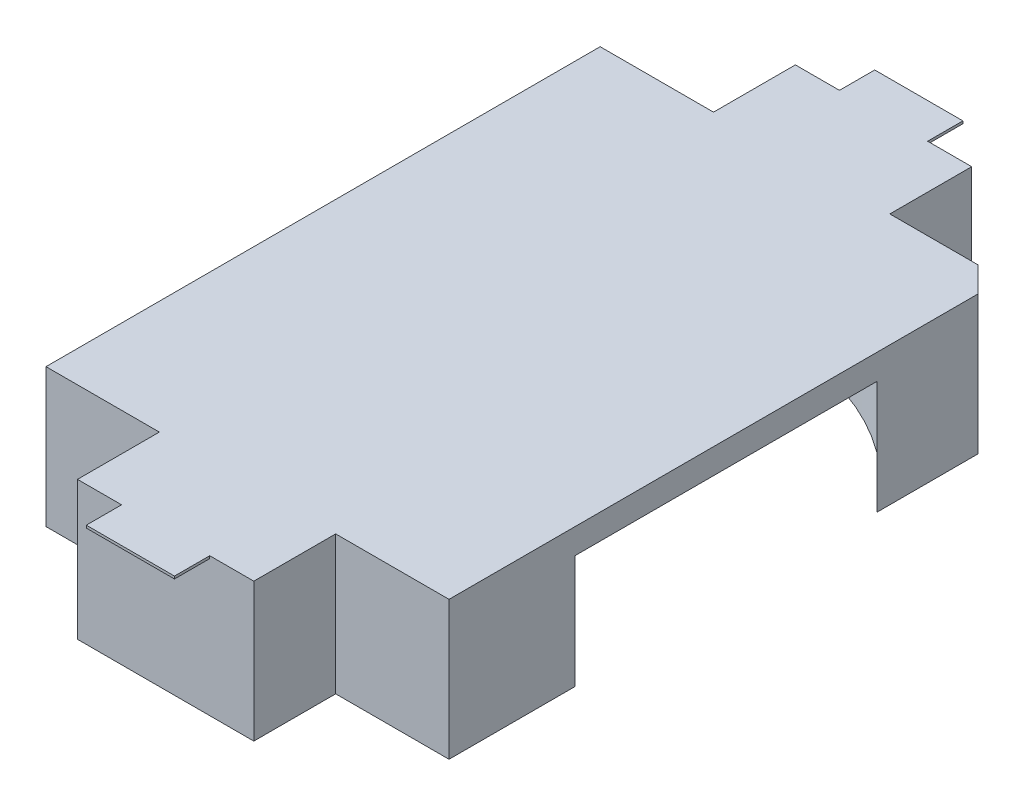
ISO-10303-21;
HEADER;
FILE_DESCRIPTION(('STEP AP214'),'2;1');
FILE_NAME('part.step','',(''),(''),'','','');
FILE_SCHEMA(('AUTOMOTIVE_DESIGN { 1 0 10303 214 1 1 1 1 }'));
ENDSEC;
DATA;
#1=APPLICATION_CONTEXT('core data for automotive mechanical design processes');
#2=APPLICATION_PROTOCOL_DEFINITION('international standard','automotive_design',2000,#1);
#3=PRODUCT_CONTEXT('',#1,'mechanical');
#4=PRODUCT('Part','Part','',(#3));
#5=PRODUCT_RELATED_PRODUCT_CATEGORY('part','',(#4));
#6=PRODUCT_DEFINITION_FORMATION('','',#4);
#7=PRODUCT_DEFINITION_CONTEXT('part definition',#1,'design');
#8=PRODUCT_DEFINITION('design','',#6,#7);
#9=PRODUCT_DEFINITION_SHAPE('','',#8);
#10=(LENGTH_UNIT() NAMED_UNIT(*) SI_UNIT(.MILLI.,.METRE.));
#11=(NAMED_UNIT(*) PLANE_ANGLE_UNIT() SI_UNIT($,.RADIAN.));
#12=(NAMED_UNIT(*) SI_UNIT($,.STERADIAN.) SOLID_ANGLE_UNIT());
#13=UNCERTAINTY_MEASURE_WITH_UNIT(LENGTH_MEASURE(1.E-05),#10,'distance_accuracy_value','');
#14=(GEOMETRIC_REPRESENTATION_CONTEXT(3) GLOBAL_UNCERTAINTY_ASSIGNED_CONTEXT((#13)) GLOBAL_UNIT_ASSIGNED_CONTEXT((#10,
#11,#12)) REPRESENTATION_CONTEXT('',''));
#15=CARTESIAN_POINT('',(0.,0.,0.));
#16=DIRECTION('',(0.,0.,1.));
#17=DIRECTION('',(1.,0.,0.));
#18=AXIS2_PLACEMENT_3D('',#15,#16,#17);
#19=CARTESIAN_POINT('',(-0.872244826069845,-4.4,7.66645635431473));
#20=DIRECTION('',(1.,0.,0.));
#21=DIRECTION('',(0.,0.,-1.));
#22=AXIS2_PLACEMENT_3D('',#19,#20,#21);
#23=PLANE('',#22);
#24=DIRECTION('',(0.,0.,1.));
#25=VECTOR('',#24,1.);
#26=CARTESIAN_POINT('',(-0.872244826069845,-4.5,7.66645635431473));
#27=LINE('',#26,#25);
#28=CARTESIAN_POINT('',(-0.872244826069845,-4.5,7.66645635431473));
#29=VERTEX_POINT('',#28);
#30=CARTESIAN_POINT('',(-0.872244826069844,-4.5,10.5335098182309));
#31=VERTEX_POINT('',#30);
#32=EDGE_CURVE('E127',#29,#31,#27,.T.);
#33=ORIENTED_EDGE('',*,*,#32,.F.);
#34=DIRECTION('',(0.,-1.,0.));
#35=VECTOR('',#34,1.);
#36=CARTESIAN_POINT('',(-0.872244826069845,-4.4,7.66645635431473));
#37=LINE('',#36,#35);
#38=CARTESIAN_POINT('',(-0.872244826069845,-4.4,7.66645635431473));
#39=VERTEX_POINT('',#38);
#40=EDGE_CURVE('E12',#39,#29,#37,.T.);
#41=ORIENTED_EDGE('',*,*,#40,.F.);
#42=DIRECTION('',(0.,0.,1.));
#43=VECTOR('',#42,1.);
#44=CARTESIAN_POINT('',(-0.872244826069845,-4.4,7.66645635431473));
#45=LINE('',#44,#43);
#46=CARTESIAN_POINT('',(-0.872244826069844,-4.4,10.5335098182309));
#47=VERTEX_POINT('',#46);
#48=EDGE_CURVE('E118',#39,#47,#45,.T.);
#49=ORIENTED_EDGE('',*,*,#48,.T.);
#50=DIRECTION('',(0.,-1.,0.));
#51=VECTOR('',#50,1.);
#52=CARTESIAN_POINT('',(-0.872244826069844,-4.4,10.5335098182309));
#53=LINE('',#52,#51);
#54=EDGE_CURVE('E59',#47,#31,#53,.T.);
#55=ORIENTED_EDGE('',*,*,#54,.T.);
#56=EDGE_LOOP('',(#33,#41,#49,#55));
#57=FACE_BOUND('',#56,.T.);
#58=ADVANCED_FACE('F56',(#57),#23,.T.);
#59=CARTESIAN_POINT('',(-1.8664561681021,-4.4,7.66645635431473));
#60=DIRECTION('',(0.,0.,-1.));
#61=DIRECTION('',(-1.,0.,0.));
#62=AXIS2_PLACEMENT_3D('',#59,#60,#61);
#63=PLANE('',#62);
#64=DIRECTION('',(1.,0.,0.));
#65=VECTOR('',#64,1.);
#66=CARTESIAN_POINT('',(-1.8664561681021,-4.5,7.66645635431473));
#67=LINE('',#66,#65);
#68=CARTESIAN_POINT('',(-1.8664561681021,-4.5,7.66645635431473));
#69=VERTEX_POINT('',#68);
#70=EDGE_CURVE('E123',#69,#29,#67,.T.);
#71=ORIENTED_EDGE('',*,*,#70,.F.);
#72=DIRECTION('',(0.,-1.,0.));
#73=VECTOR('',#72,1.);
#74=CARTESIAN_POINT('',(-1.8664561681021,-4.4,7.66645635431473));
#75=LINE('',#74,#73);
#76=CARTESIAN_POINT('',(-1.8664561681021,-4.4,7.66645635431473));
#77=VERTEX_POINT('',#76);
#78=EDGE_CURVE('E66',#77,#69,#75,.T.);
#79=ORIENTED_EDGE('',*,*,#78,.F.);
#80=DIRECTION('',(1.,0.,0.));
#81=VECTOR('',#80,1.);
#82=CARTESIAN_POINT('',(-1.8664561681021,-4.4,7.66645635431473));
#83=LINE('',#82,#81);
#84=EDGE_CURVE('E113',#77,#39,#83,.T.);
#85=ORIENTED_EDGE('',*,*,#84,.T.);
#86=ORIENTED_EDGE('',*,*,#40,.T.);
#87=EDGE_LOOP('',(#71,#79,#85,#86));
#88=FACE_BOUND('',#87,.T.);
#89=ADVANCED_FACE('F142',(#88),#63,.T.);
#90=CARTESIAN_POINT('',(-1.8664561681021,-4.4,10.5335098182309));
#91=DIRECTION('',(-1.,0.,0.));
#92=DIRECTION('',(0.,0.,1.));
#93=AXIS2_PLACEMENT_3D('',#90,#91,#92);
#94=PLANE('',#93);
#95=DIRECTION('',(0.,0.,-1.));
#96=VECTOR('',#95,1.);
#97=CARTESIAN_POINT('',(-1.8664561681021,-4.5,10.5335098182309));
#98=LINE('',#97,#96);
#99=CARTESIAN_POINT('',(-1.8664561681021,-4.5,10.5335098182309));
#100=VERTEX_POINT('',#99);
#101=EDGE_CURVE('E107',#100,#69,#98,.T.);
#102=ORIENTED_EDGE('',*,*,#101,.F.);
#103=DIRECTION('',(0.,-1.,0.));
#104=VECTOR('',#103,1.);
#105=CARTESIAN_POINT('',(-1.8664561681021,-4.4,10.5335098182309));
#106=LINE('',#105,#104);
#107=CARTESIAN_POINT('',(-1.8664561681021,-4.4,10.5335098182309));
#108=VERTEX_POINT('',#107);
#109=EDGE_CURVE('E102',#108,#100,#106,.T.);
#110=ORIENTED_EDGE('',*,*,#109,.F.);
#111=DIRECTION('',(0.,0.,-1.));
#112=VECTOR('',#111,1.);
#113=CARTESIAN_POINT('',(-1.8664561681021,-4.4,10.5335098182309));
#114=LINE('',#113,#112);
#115=EDGE_CURVE('E105',#108,#77,#114,.T.);
#116=ORIENTED_EDGE('',*,*,#115,.T.);
#117=ORIENTED_EDGE('',*,*,#78,.T.);
#118=EDGE_LOOP('',(#102,#110,#116,#117));
#119=FACE_BOUND('',#118,.T.);
#120=ADVANCED_FACE('F104',(#119),#94,.T.);
#121=CARTESIAN_POINT('',(-0.872244826069844,-4.4,10.5335098182309));
#122=DIRECTION('',(0.,0.,1.));
#123=DIRECTION('',(1.,0.,0.));
#124=AXIS2_PLACEMENT_3D('',#121,#122,#123);
#125=PLANE('',#124);
#126=DIRECTION('',(-1.,0.,0.));
#127=VECTOR('',#126,1.);
#128=CARTESIAN_POINT('',(-0.872244826069844,-4.5,10.5335098182309));
#129=LINE('',#128,#127);
#130=EDGE_CURVE('E131',#31,#100,#129,.T.);
#131=ORIENTED_EDGE('',*,*,#130,.F.);
#132=ORIENTED_EDGE('',*,*,#54,.F.);
#133=DIRECTION('',(-1.,0.,0.));
#134=VECTOR('',#133,1.);
#135=CARTESIAN_POINT('',(-0.872244826069844,-4.4,10.5335098182309));
#136=LINE('',#135,#134);
#137=EDGE_CURVE('E112',#47,#108,#136,.T.);
#138=ORIENTED_EDGE('',*,*,#137,.T.);
#139=ORIENTED_EDGE('',*,*,#109,.T.);
#140=EDGE_LOOP('',(#131,#132,#138,#139));
#141=FACE_BOUND('',#140,.T.);
#142=ADVANCED_FACE('F116',(#141),#125,.T.);
#143=CARTESIAN_POINT('',(0.,-4.4,0.));
#144=DIRECTION('',(0.,-1.,0.));
#145=DIRECTION('',(0.,0.,-1.));
#146=AXIS2_PLACEMENT_3D('',#143,#144,#145);
#147=PLANE('',#146);
#148=ORIENTED_EDGE('',*,*,#48,.F.);
#149=ORIENTED_EDGE('',*,*,#84,.F.);
#150=ORIENTED_EDGE('',*,*,#115,.F.);
#151=ORIENTED_EDGE('',*,*,#137,.F.);
#152=EDGE_LOOP('',(#148,#149,#150,#151));
#153=FACE_BOUND('',#152,.T.);
#154=ADVANCED_FACE('F111',(#153),#147,.F.);
#155=CARTESIAN_POINT('',(0.,-4.5,0.));
#156=DIRECTION('',(0.,-1.,0.));
#157=DIRECTION('',(0.,0.,-1.));
#158=AXIS2_PLACEMENT_3D('',#155,#156,#157);
#159=PLANE('',#158);
#160=ORIENTED_EDGE('',*,*,#32,.T.);
#161=ORIENTED_EDGE('',*,*,#130,.T.);
#162=ORIENTED_EDGE('',*,*,#101,.T.);
#163=ORIENTED_EDGE('',*,*,#70,.T.);
#164=EDGE_LOOP('',(#160,#161,#162,#163));
#165=FACE_BOUND('',#164,.T.);
#166=ADVANCED_FACE('F141',(#165),#159,.T.);
#167=CLOSED_SHELL('',(#58,#89,#120,#142,#154,#166));
#168=MANIFOLD_SOLID_BREP('B2',#167);
#169=CARTESIAN_POINT('',(0.872244826069846,-4.4,10.5335098182309));
#170=DIRECTION('',(0.,0.,1.));
#171=DIRECTION('',(1.,0.,0.));
#172=AXIS2_PLACEMENT_3D('',#169,#170,#171);
#173=PLANE('',#172);
#174=DIRECTION('',(-1.,0.,0.));
#175=VECTOR('',#174,1.);
#176=CARTESIAN_POINT('',(0.872244826069846,-4.5,10.5335098182309));
#177=LINE('',#176,#175);
#178=CARTESIAN_POINT('',(1.8664561681021,-4.5,10.5335098182309));
#179=VERTEX_POINT('',#178);
#180=CARTESIAN_POINT('',(0.872244826069846,-4.5,10.5335098182309));
#181=VERTEX_POINT('',#180);
#182=EDGE_CURVE('E280',#179,#181,#177,.T.);
#183=ORIENTED_EDGE('',*,*,#182,.F.);
#184=DIRECTION('',(0.,-1.,0.));
#185=VECTOR('',#184,1.);
#186=CARTESIAN_POINT('',(1.8664561681021,-4.4,10.5335098182309));
#187=LINE('',#186,#185);
#188=CARTESIAN_POINT('',(1.8664561681021,-4.4,10.5335098182309));
#189=VERTEX_POINT('',#188);
#190=EDGE_CURVE('E54',#189,#179,#187,.T.);
#191=ORIENTED_EDGE('',*,*,#190,.F.);
#192=DIRECTION('',(-1.,0.,0.));
#193=VECTOR('',#192,1.);
#194=CARTESIAN_POINT('',(0.872244826069846,-4.4,10.5335098182309));
#195=LINE('',#194,#193);
#196=CARTESIAN_POINT('',(0.872244826069846,-4.4,10.5335098182309));
#197=VERTEX_POINT('',#196);
#198=EDGE_CURVE('E271',#189,#197,#195,.T.);
#199=ORIENTED_EDGE('',*,*,#198,.T.);
#200=DIRECTION('',(0.,-1.,0.));
#201=VECTOR('',#200,1.);
#202=CARTESIAN_POINT('',(0.872244826069846,-4.4,10.5335098182309));
#203=LINE('',#202,#201);
#204=EDGE_CURVE('E212',#197,#181,#203,.T.);
#205=ORIENTED_EDGE('',*,*,#204,.T.);
#206=EDGE_LOOP('',(#183,#191,#199,#205));
#207=FACE_BOUND('',#206,.T.);
#208=ADVANCED_FACE('F209',(#207),#173,.T.);
#209=CARTESIAN_POINT('',(1.8664561681021,-4.4,10.5335098182309));
#210=DIRECTION('',(1.,0.,0.));
#211=DIRECTION('',(0.,0.,-1.));
#212=AXIS2_PLACEMENT_3D('',#209,#210,#211);
#213=PLANE('',#212);
#214=DIRECTION('',(0.,0.,1.));
#215=VECTOR('',#214,1.);
#216=CARTESIAN_POINT('',(1.8664561681021,-4.5,10.5335098182309));
#217=LINE('',#216,#215);
#218=CARTESIAN_POINT('',(1.8664561681021,-4.5,7.66645635431473));
#219=VERTEX_POINT('',#218);
#220=EDGE_CURVE('E275',#219,#179,#217,.T.);
#221=ORIENTED_EDGE('',*,*,#220,.F.);
#222=DIRECTION('',(0.,-1.,0.));
#223=VECTOR('',#222,1.);
#224=CARTESIAN_POINT('',(1.8664561681021,-4.4,7.66645635431473));
#225=LINE('',#224,#223);
#226=CARTESIAN_POINT('',(1.8664561681021,-4.4,7.66645635431473));
#227=VERTEX_POINT('',#226);
#228=EDGE_CURVE('E219',#227,#219,#225,.T.);
#229=ORIENTED_EDGE('',*,*,#228,.F.);
#230=DIRECTION('',(0.,0.,1.));
#231=VECTOR('',#230,1.);
#232=CARTESIAN_POINT('',(1.8664561681021,-4.4,10.5335098182309));
#233=LINE('',#232,#231);
#234=EDGE_CURVE('E266',#227,#189,#233,.T.);
#235=ORIENTED_EDGE('',*,*,#234,.T.);
#236=ORIENTED_EDGE('',*,*,#190,.T.);
#237=EDGE_LOOP('',(#221,#229,#235,#236));
#238=FACE_BOUND('',#237,.T.);
#239=ADVANCED_FACE('F295',(#238),#213,.T.);
#240=CARTESIAN_POINT('',(1.8664561681021,-4.4,7.66645635431473));
#241=DIRECTION('',(0.,0.,-1.));
#242=DIRECTION('',(-1.,0.,0.));
#243=AXIS2_PLACEMENT_3D('',#240,#241,#242);
#244=PLANE('',#243);
#245=DIRECTION('',(1.,0.,0.));
#246=VECTOR('',#245,1.);
#247=CARTESIAN_POINT('',(1.8664561681021,-4.5,7.66645635431473));
#248=LINE('',#247,#246);
#249=CARTESIAN_POINT('',(0.872244826069846,-4.5,7.66645635431473));
#250=VERTEX_POINT('',#249);
#251=EDGE_CURVE('E260',#250,#219,#248,.T.);
#252=ORIENTED_EDGE('',*,*,#251,.F.);
#253=DIRECTION('',(0.,-1.,0.));
#254=VECTOR('',#253,1.);
#255=CARTESIAN_POINT('',(0.872244826069846,-4.4,7.66645635431473));
#256=LINE('',#255,#254);
#257=CARTESIAN_POINT('',(0.872244826069846,-4.4,7.66645635431473));
#258=VERTEX_POINT('',#257);
#259=EDGE_CURVE('E255',#258,#250,#256,.T.);
#260=ORIENTED_EDGE('',*,*,#259,.F.);
#261=DIRECTION('',(1.,0.,0.));
#262=VECTOR('',#261,1.);
#263=CARTESIAN_POINT('',(1.8664561681021,-4.4,7.66645635431473));
#264=LINE('',#263,#262);
#265=EDGE_CURVE('E258',#258,#227,#264,.T.);
#266=ORIENTED_EDGE('',*,*,#265,.T.);
#267=ORIENTED_EDGE('',*,*,#228,.T.);
#268=EDGE_LOOP('',(#252,#260,#266,#267));
#269=FACE_BOUND('',#268,.T.);
#270=ADVANCED_FACE('F257',(#269),#244,.T.);
#271=CARTESIAN_POINT('',(0.872244826069846,-4.4,7.66645635431473));
#272=DIRECTION('',(-1.,0.,0.));
#273=DIRECTION('',(0.,0.,1.));
#274=AXIS2_PLACEMENT_3D('',#271,#272,#273);
#275=PLANE('',#274);
#276=DIRECTION('',(0.,0.,-1.));
#277=VECTOR('',#276,1.);
#278=CARTESIAN_POINT('',(0.872244826069846,-4.5,7.66645635431473));
#279=LINE('',#278,#277);
#280=EDGE_CURVE('E284',#181,#250,#279,.T.);
#281=ORIENTED_EDGE('',*,*,#280,.F.);
#282=ORIENTED_EDGE('',*,*,#204,.F.);
#283=DIRECTION('',(0.,0.,-1.));
#284=VECTOR('',#283,1.);
#285=CARTESIAN_POINT('',(0.872244826069846,-4.4,7.66645635431473));
#286=LINE('',#285,#284);
#287=EDGE_CURVE('E265',#197,#258,#286,.T.);
#288=ORIENTED_EDGE('',*,*,#287,.T.);
#289=ORIENTED_EDGE('',*,*,#259,.T.);
#290=EDGE_LOOP('',(#281,#282,#288,#289));
#291=FACE_BOUND('',#290,.T.);
#292=ADVANCED_FACE('F269',(#291),#275,.T.);
#293=CARTESIAN_POINT('',(0.,-4.4,0.));
#294=DIRECTION('',(0.,1.,0.));
#295=DIRECTION('',(0.,0.,1.));
#296=AXIS2_PLACEMENT_3D('',#293,#294,#295);
#297=PLANE('',#296);
#298=ORIENTED_EDGE('',*,*,#198,.F.);
#299=ORIENTED_EDGE('',*,*,#234,.F.);
#300=ORIENTED_EDGE('',*,*,#265,.F.);
#301=ORIENTED_EDGE('',*,*,#287,.F.);
#302=EDGE_LOOP('',(#298,#299,#300,#301));
#303=FACE_BOUND('',#302,.T.);
#304=ADVANCED_FACE('F264',(#303),#297,.T.);
#305=CARTESIAN_POINT('',(0.,-4.5,0.));
#306=DIRECTION('',(0.,1.,0.));
#307=DIRECTION('',(0.,0.,1.));
#308=AXIS2_PLACEMENT_3D('',#305,#306,#307);
#309=PLANE('',#308);
#310=ORIENTED_EDGE('',*,*,#182,.T.);
#311=ORIENTED_EDGE('',*,*,#280,.T.);
#312=ORIENTED_EDGE('',*,*,#251,.T.);
#313=ORIENTED_EDGE('',*,*,#220,.T.);
#314=EDGE_LOOP('',(#310,#311,#312,#313));
#315=FACE_BOUND('',#314,.T.);
#316=ADVANCED_FACE('F294',(#315),#309,.F.);
#317=CLOSED_SHELL('',(#208,#239,#270,#292,#304,#316));
#318=MANIFOLD_SOLID_BREP('B6',#317);
#319=CARTESIAN_POINT('',(-8.00000000000001,1.,-11.));
#320=DIRECTION('',(0.,0.,1.));
#321=DIRECTION('',(1.,0.,0.));
#322=AXIS2_PLACEMENT_3D('',#319,#320,#321);
#323=PLANE('',#322);
#324=DIRECTION('',(0.,1.,0.));
#325=VECTOR('',#324,1.);
#326=CARTESIAN_POINT('',(-3.5,-12.2176745202166,-11.));
#327=LINE('',#326,#325);
#328=CARTESIAN_POINT('',(-3.5,-4.5,-11.));
#329=VERTEX_POINT('',#328);
#330=CARTESIAN_POINT('',(-3.5,1.,-11.));
#331=VERTEX_POINT('',#330);
#332=EDGE_CURVE('E616',#329,#331,#327,.T.);
#333=ORIENTED_EDGE('',*,*,#332,.F.);
#334=DIRECTION('',(1.,0.,0.));
#335=VECTOR('',#334,1.);
#336=CARTESIAN_POINT('',(7.,-4.5,-11.));
#337=LINE('',#336,#335);
#338=CARTESIAN_POINT('',(-8.00000000000001,-4.5,-11.));
#339=VERTEX_POINT('',#338);
#340=EDGE_CURVE('E692',#339,#329,#337,.T.);
#341=ORIENTED_EDGE('',*,*,#340,.F.);
#342=DIRECTION('',(0.,-1.,0.));
#343=VECTOR('',#342,1.);
#344=CARTESIAN_POINT('',(-8.00000000000001,1.,-11.));
#345=LINE('',#344,#343);
#346=CARTESIAN_POINT('',(-8.00000000000001,1.,-11.));
#347=VERTEX_POINT('',#346);
#348=EDGE_CURVE('E744',#347,#339,#345,.T.);
#349=ORIENTED_EDGE('',*,*,#348,.F.);
#350=DIRECTION('',(-1.,0.,0.));
#351=VECTOR('',#350,1.);
#352=CARTESIAN_POINT('',(-8.00000000000001,1.,-11.));
#353=LINE('',#352,#351);
#354=EDGE_CURVE('E739',#331,#347,#353,.T.);
#355=ORIENTED_EDGE('',*,*,#354,.F.);
#356=EDGE_LOOP('',(#333,#341,#349,#355));
#357=FACE_BOUND('',#356,.T.);
#358=ADVANCED_FACE('F353',(#357),#323,.F.);
#359=CARTESIAN_POINT('',(-8.00000000000001,1.,11.));
#360=DIRECTION('',(0.,0.,-1.));
#361=DIRECTION('',(-1.,0.,0.));
#362=AXIS2_PLACEMENT_3D('',#359,#360,#361);
#363=PLANE('',#362);
#364=DIRECTION('',(0.,1.,0.));
#365=VECTOR('',#364,1.);
#366=CARTESIAN_POINT('',(3.5,-12.2176745202166,11.));
#367=LINE('',#366,#365);
#368=CARTESIAN_POINT('',(3.5,-4.5,11.));
#369=VERTEX_POINT('',#368);
#370=CARTESIAN_POINT('',(3.5,1.,11.));
#371=VERTEX_POINT('',#370);
#372=EDGE_CURVE('E654',#369,#371,#367,.T.);
#373=ORIENTED_EDGE('',*,*,#372,.F.);
#374=DIRECTION('',(-1.,0.,0.));
#375=VECTOR('',#374,1.);
#376=CARTESIAN_POINT('',(-8.00000000000001,-4.5,11.));
#377=LINE('',#376,#375);
#378=CARTESIAN_POINT('',(7.99999999999999,-4.5,11.));
#379=VERTEX_POINT('',#378);
#380=EDGE_CURVE('E678',#379,#369,#377,.T.);
#381=ORIENTED_EDGE('',*,*,#380,.F.);
#382=DIRECTION('',(0.,-1.,0.));
#383=VECTOR('',#382,1.);
#384=CARTESIAN_POINT('',(7.99999999999999,1.,11.));
#385=LINE('',#384,#383);
#386=CARTESIAN_POINT('',(7.99999999999999,1.,11.));
#387=VERTEX_POINT('',#386);
#388=EDGE_CURVE('E759',#387,#379,#385,.T.);
#389=ORIENTED_EDGE('',*,*,#388,.F.);
#390=DIRECTION('',(1.,0.,0.));
#391=VECTOR('',#390,1.);
#392=CARTESIAN_POINT('',(-8.00000000000001,1.,11.));
#393=LINE('',#392,#391);
#394=EDGE_CURVE('E727',#371,#387,#393,.T.);
#395=ORIENTED_EDGE('',*,*,#394,.F.);
#396=EDGE_LOOP('',(#373,#381,#389,#395));
#397=FACE_BOUND('',#396,.T.);
#398=ADVANCED_FACE('F875',(#397),#363,.F.);
#399=CARTESIAN_POINT('',(0.,0.,0.));
#400=DIRECTION('',(0.,-1.,0.));
#401=DIRECTION('',(0.,0.,-1.));
#402=AXIS2_PLACEMENT_3D('',#399,#400,#401);
#403=PLANE('',#402);
#404=DIRECTION('',(0.,0.,-1.));
#405=VECTOR('',#404,1.);
#406=CARTESIAN_POINT('',(7.99999999999999,0.,11.));
#407=LINE('',#406,#405);
#408=CARTESIAN_POINT('',(7.99999999999999,0.,5.99999999999999));
#409=VERTEX_POINT('',#408);
#410=CARTESIAN_POINT('',(7.99999999999999,0.,-6.00000000000001));
#411=VERTEX_POINT('',#410);
#412=EDGE_CURVE('E728',#409,#411,#407,.T.);
#413=ORIENTED_EDGE('',*,*,#412,.F.);
#414=CARTESIAN_POINT('',(0.,0.,0.));
#415=DIRECTION('',(0.,1.,0.));
#416=DIRECTION('',(0.,0.,-1.));
#417=AXIS2_PLACEMENT_3D('',#414,#415,#416);
#418=CIRCLE('',#417,10.);
#419=CARTESIAN_POINT('',(-8.00000000000001,0.,5.99999999999999));
#420=VERTEX_POINT('',#419);
#421=EDGE_CURVE('E665',#420,#409,#418,.T.);
#422=ORIENTED_EDGE('',*,*,#421,.F.);
#423=DIRECTION('',(0.,0.,1.));
#424=VECTOR('',#423,1.);
#425=CARTESIAN_POINT('',(-8.00000000000001,0.,11.));
#426=LINE('',#425,#424);
#427=CARTESIAN_POINT('',(-8.00000000000001,0.,-5.99999999999999));
#428=VERTEX_POINT('',#427);
#429=EDGE_CURVE('E722',#428,#420,#426,.T.);
#430=ORIENTED_EDGE('',*,*,#429,.F.);
#431=CARTESIAN_POINT('',(0.,0.,0.));
#432=DIRECTION('',(0.,1.,0.));
#433=DIRECTION('',(0.,0.,-1.));
#434=AXIS2_PLACEMENT_3D('',#431,#432,#433);
#435=CIRCLE('',#434,10.);
#436=EDGE_CURVE('E691',#411,#428,#435,.T.);
#437=ORIENTED_EDGE('',*,*,#436,.F.);
#438=EDGE_LOOP('',(#413,#422,#430,#437));
#439=FACE_BOUND('',#438,.T.);
#440=ADVANCED_FACE('F949',(#439),#403,.T.);
#441=CARTESIAN_POINT('',(-8.00000000000001,1.,11.));
#442=DIRECTION('',(1.,0.,0.));
#443=DIRECTION('',(0.,0.,-1.));
#444=AXIS2_PLACEMENT_3D('',#441,#442,#443);
#445=PLANE('',#444);
#446=ORIENTED_EDGE('',*,*,#348,.T.);
#447=DIRECTION('',(0.,0.,-1.));
#448=VECTOR('',#447,1.);
#449=CARTESIAN_POINT('',(-8.00000000000001,-4.5,-11.));
#450=LINE('',#449,#448);
#451=CARTESIAN_POINT('',(-8.00000000000001,-4.5,-5.99999999999999));
#452=VERTEX_POINT('',#451);
#453=EDGE_CURVE('E707',#452,#339,#450,.T.);
#454=ORIENTED_EDGE('',*,*,#453,.F.);
#455=DIRECTION('',(0.,1.,0.));
#456=VECTOR('',#455,1.);
#457=CARTESIAN_POINT('',(-8.00000000000001,-4.5,-5.99999999999999));
#458=LINE('',#457,#456);
#459=EDGE_CURVE('E711',#452,#428,#458,.T.);
#460=ORIENTED_EDGE('',*,*,#459,.T.);
#461=ORIENTED_EDGE('',*,*,#429,.T.);
#462=DIRECTION('',(0.,1.,0.));
#463=VECTOR('',#462,1.);
#464=CARTESIAN_POINT('',(-8.00000000000001,-4.5,5.99999999999999));
#465=LINE('',#464,#463);
#466=CARTESIAN_POINT('',(-8.00000000000001,-4.5,5.99999999999999));
#467=VERTEX_POINT('',#466);
#468=EDGE_CURVE('E688',#467,#420,#465,.T.);
#469=ORIENTED_EDGE('',*,*,#468,.F.);
#470=DIRECTION('',(0.,0.,-1.));
#471=VECTOR('',#470,1.);
#472=CARTESIAN_POINT('',(-8.00000000000001,-4.5,5.99999999999999));
#473=LINE('',#472,#471);
#474=CARTESIAN_POINT('',(-8.00000000000001,-4.5,11.));
#475=VERTEX_POINT('',#474);
#476=EDGE_CURVE('E666',#475,#467,#473,.T.);
#477=ORIENTED_EDGE('',*,*,#476,.F.);
#478=DIRECTION('',(0.,-1.,0.));
#479=VECTOR('',#478,1.);
#480=CARTESIAN_POINT('',(-8.00000000000001,1.,11.));
#481=LINE('',#480,#479);
#482=CARTESIAN_POINT('',(-8.00000000000001,1.,11.));
#483=VERTEX_POINT('',#482);
#484=EDGE_CURVE('E762',#483,#475,#481,.T.);
#485=ORIENTED_EDGE('',*,*,#484,.F.);
#486=DIRECTION('',(0.,0.,1.));
#487=VECTOR('',#486,1.);
#488=CARTESIAN_POINT('',(-8.00000000000001,1.,11.));
#489=LINE('',#488,#487);
#490=EDGE_CURVE('E723',#347,#483,#489,.T.);
#491=ORIENTED_EDGE('',*,*,#490,.F.);
#492=EDGE_LOOP('',(#446,#454,#460,#461,#469,#477,#485,#491));
#493=FACE_BOUND('',#492,.T.);
#494=ADVANCED_FACE('F355',(#493),#445,.F.);
#495=CARTESIAN_POINT('',(-3.5,-4.5,11.));
#496=VERTEX_POINT('',#495);
#497=EDGE_CURVE('E677',#496,#475,#377,.T.);
#498=ORIENTED_EDGE('',*,*,#497,.F.);
#499=DIRECTION('',(0.,1.,0.));
#500=VECTOR('',#499,1.);
#501=CARTESIAN_POINT('',(-3.5,-12.2176745202166,11.));
#502=LINE('',#501,#500);
#503=CARTESIAN_POINT('',(-3.5,1.,11.));
#504=VERTEX_POINT('',#503);
#505=EDGE_CURVE('E650',#496,#504,#502,.T.);
#506=ORIENTED_EDGE('',*,*,#505,.T.);
#507=EDGE_CURVE('E729',#483,#504,#393,.T.);
#508=ORIENTED_EDGE('',*,*,#507,.F.);
#509=ORIENTED_EDGE('',*,*,#484,.T.);
#510=EDGE_LOOP('',(#498,#506,#508,#509));
#511=FACE_BOUND('',#510,.T.);
#512=ADVANCED_FACE('F917',(#511),#363,.F.);
#513=CARTESIAN_POINT('',(7.99999999999999,1.,11.));
#514=DIRECTION('',(-1.,0.,0.));
#515=DIRECTION('',(0.,0.,1.));
#516=AXIS2_PLACEMENT_3D('',#513,#514,#515);
#517=PLANE('',#516);
#518=ORIENTED_EDGE('',*,*,#388,.T.);
#519=DIRECTION('',(0.,0.,1.));
#520=VECTOR('',#519,1.);
#521=CARTESIAN_POINT('',(7.99999999999999,-4.5,11.));
#522=LINE('',#521,#520);
#523=CARTESIAN_POINT('',(7.99999999999999,-4.5,6.00000000000001));
#524=VERTEX_POINT('',#523);
#525=EDGE_CURVE('E673',#524,#379,#522,.T.);
#526=ORIENTED_EDGE('',*,*,#525,.F.);
#527=DIRECTION('',(0.,1.,0.));
#528=VECTOR('',#527,1.);
#529=CARTESIAN_POINT('',(7.99999999999999,-4.5,6.00000000000001));
#530=LINE('',#529,#528);
#531=EDGE_CURVE('E682',#524,#409,#530,.T.);
#532=ORIENTED_EDGE('',*,*,#531,.T.);
#533=ORIENTED_EDGE('',*,*,#412,.T.);
#534=DIRECTION('',(0.,1.,0.));
#535=VECTOR('',#534,1.);
#536=CARTESIAN_POINT('',(7.99999999999999,-4.5,-6.00000000000001));
#537=LINE('',#536,#535);
#538=CARTESIAN_POINT('',(7.99999999999999,-4.5,-6.00000000000001));
#539=VERTEX_POINT('',#538);
#540=EDGE_CURVE('E718',#539,#411,#537,.T.);
#541=ORIENTED_EDGE('',*,*,#540,.F.);
#542=DIRECTION('',(0.,0.,1.));
#543=VECTOR('',#542,1.);
#544=CARTESIAN_POINT('',(7.99999999999999,-4.5,-6.00000000000001));
#545=LINE('',#544,#543);
#546=CARTESIAN_POINT('',(7.99999999999999,-4.5,-10.));
#547=VERTEX_POINT('',#546);
#548=EDGE_CURVE('E701',#547,#539,#545,.T.);
#549=ORIENTED_EDGE('',*,*,#548,.F.);
#550=DIRECTION('',(0.,-1.,0.));
#551=VECTOR('',#550,1.);
#552=CARTESIAN_POINT('',(7.99999999999999,1.,-10.));
#553=LINE('',#552,#551);
#554=CARTESIAN_POINT('',(7.99999999999999,1.,-10.));
#555=VERTEX_POINT('',#554);
#556=EDGE_CURVE('E756',#555,#547,#553,.T.);
#557=ORIENTED_EDGE('',*,*,#556,.F.);
#558=DIRECTION('',(0.,0.,-1.));
#559=VECTOR('',#558,1.);
#560=CARTESIAN_POINT('',(7.99999999999999,1.,11.));
#561=LINE('',#560,#559);
#562=EDGE_CURVE('E733',#387,#555,#561,.T.);
#563=ORIENTED_EDGE('',*,*,#562,.F.);
#564=EDGE_LOOP('',(#518,#526,#532,#533,#541,#549,#557,#563));
#565=FACE_BOUND('',#564,.T.);
#566=ADVANCED_FACE('F882',(#565),#517,.F.);
#567=CARTESIAN_POINT('',(7.,1.,-11.));
#568=DIRECTION('',(-0.707106781186548,0.,0.707106781186548));
#569=DIRECTION('',(0.707106781186548,0.,0.707106781186548));
#570=AXIS2_PLACEMENT_3D('',#567,#568,#569);
#571=PLANE('',#570);
#572=ORIENTED_EDGE('',*,*,#556,.T.);
#573=DIRECTION('',(0.707106781186548,0.,0.707106781186548));
#574=VECTOR('',#573,1.);
#575=CARTESIAN_POINT('',(7.99999999999999,-4.5,-10.));
#576=LINE('',#575,#574);
#577=CARTESIAN_POINT('',(7.,-4.5,-11.));
#578=VERTEX_POINT('',#577);
#579=EDGE_CURVE('E696',#578,#547,#576,.T.);
#580=ORIENTED_EDGE('',*,*,#579,.F.);
#581=DIRECTION('',(0.,-1.,0.));
#582=VECTOR('',#581,1.);
#583=CARTESIAN_POINT('',(7.,1.,-11.));
#584=LINE('',#583,#582);
#585=CARTESIAN_POINT('',(7.,1.,-11.));
#586=VERTEX_POINT('',#585);
#587=EDGE_CURVE('E752',#586,#578,#584,.T.);
#588=ORIENTED_EDGE('',*,*,#587,.F.);
#589=DIRECTION('',(-0.707106781186548,0.,-0.707106781186548));
#590=VECTOR('',#589,1.);
#591=CARTESIAN_POINT('',(7.,1.,-11.));
#592=LINE('',#591,#590);
#593=EDGE_CURVE('E736',#555,#586,#592,.T.);
#594=ORIENTED_EDGE('',*,*,#593,.F.);
#595=EDGE_LOOP('',(#572,#580,#588,#594));
#596=FACE_BOUND('',#595,.T.);
#597=ADVANCED_FACE('F891',(#596),#571,.F.);
#598=CARTESIAN_POINT('',(3.5,-4.5,-11.));
#599=VERTEX_POINT('',#598);
#600=EDGE_CURVE('E697',#599,#578,#337,.T.);
#601=ORIENTED_EDGE('',*,*,#600,.F.);
#602=DIRECTION('',(0.,1.,0.));
#603=VECTOR('',#602,1.);
#604=CARTESIAN_POINT('',(3.5,-12.2176745202166,-11.));
#605=LINE('',#604,#603);
#606=CARTESIAN_POINT('',(3.5,1.,-11.));
#607=VERTEX_POINT('',#606);
#608=EDGE_CURVE('E613',#599,#607,#605,.T.);
#609=ORIENTED_EDGE('',*,*,#608,.T.);
#610=EDGE_CURVE('E740',#586,#607,#353,.T.);
#611=ORIENTED_EDGE('',*,*,#610,.F.);
#612=ORIENTED_EDGE('',*,*,#587,.T.);
#613=EDGE_LOOP('',(#601,#609,#611,#612));
#614=FACE_BOUND('',#613,.T.);
#615=ADVANCED_FACE('F894',(#614),#323,.F.);
#616=CARTESIAN_POINT('',(0.,1.,0.));
#617=DIRECTION('',(0.,-1.,0.));
#618=DIRECTION('',(0.,0.,-1.));
#619=AXIS2_PLACEMENT_3D('',#616,#617,#618);
#620=PLANE('',#619);
#621=DIRECTION('',(-1.,0.,0.));
#622=VECTOR('',#621,1.);
#623=CARTESIAN_POINT('',(3.5,1.,-14.25));
#624=LINE('',#623,#622);
#625=CARTESIAN_POINT('',(3.5,1.,-14.25));
#626=VERTEX_POINT('',#625);
#627=CARTESIAN_POINT('',(1.75,1.,-14.25));
#628=VERTEX_POINT('',#627);
#629=EDGE_CURVE('E596',#626,#628,#624,.T.);
#630=ORIENTED_EDGE('',*,*,#629,.T.);
#631=DIRECTION('',(0.,0.,-1.));
#632=VECTOR('',#631,1.);
#633=CARTESIAN_POINT('',(1.75,1.,15.65));
#634=LINE('',#633,#632);
#635=CARTESIAN_POINT('',(1.75,1.,-15.65));
#636=VERTEX_POINT('',#635);
#637=EDGE_CURVE('E568',#628,#636,#634,.T.);
#638=ORIENTED_EDGE('',*,*,#637,.T.);
#639=DIRECTION('',(-1.,0.,0.));
#640=VECTOR('',#639,1.);
#641=CARTESIAN_POINT('',(1.75,1.,-15.65));
#642=LINE('',#641,#640);
#643=CARTESIAN_POINT('',(-1.75,1.,-15.65));
#644=VERTEX_POINT('',#643);
#645=EDGE_CURVE('E533',#636,#644,#642,.T.);
#646=ORIENTED_EDGE('',*,*,#645,.T.);
#647=DIRECTION('',(0.,0.,1.));
#648=VECTOR('',#647,1.);
#649=CARTESIAN_POINT('',(-1.75,1.,15.65));
#650=LINE('',#649,#648);
#651=CARTESIAN_POINT('',(-1.75,1.,-14.25));
#652=VERTEX_POINT('',#651);
#653=EDGE_CURVE('E376',#644,#652,#650,.T.);
#654=ORIENTED_EDGE('',*,*,#653,.T.);
#655=CARTESIAN_POINT('',(-3.5,1.,-14.25));
#656=VERTEX_POINT('',#655);
#657=EDGE_CURVE('E600',#652,#656,#624,.T.);
#658=ORIENTED_EDGE('',*,*,#657,.T.);
#659=DIRECTION('',(0.,0.,1.));
#660=VECTOR('',#659,1.);
#661=CARTESIAN_POINT('',(-3.5,1.,-14.25));
#662=LINE('',#661,#660);
#663=EDGE_CURVE('E591',#656,#331,#662,.T.);
#664=ORIENTED_EDGE('',*,*,#663,.T.);
#665=ORIENTED_EDGE('',*,*,#354,.T.);
#666=ORIENTED_EDGE('',*,*,#490,.T.);
#667=ORIENTED_EDGE('',*,*,#507,.T.);
#668=DIRECTION('',(0.,0.,1.));
#669=VECTOR('',#668,1.);
#670=CARTESIAN_POINT('',(-3.5,1.,11.));
#671=LINE('',#670,#669);
#672=CARTESIAN_POINT('',(-3.5,1.,14.25));
#673=VERTEX_POINT('',#672);
#674=EDGE_CURVE('E627',#504,#673,#671,.T.);
#675=ORIENTED_EDGE('',*,*,#674,.T.);
#676=DIRECTION('',(1.,0.,0.));
#677=VECTOR('',#676,1.);
#678=CARTESIAN_POINT('',(3.5,1.,14.25));
#679=LINE('',#678,#677);
#680=CARTESIAN_POINT('',(-1.75,1.,14.25));
#681=VERTEX_POINT('',#680);
#682=EDGE_CURVE('E633',#673,#681,#679,.T.);
#683=ORIENTED_EDGE('',*,*,#682,.T.);
#684=CARTESIAN_POINT('',(-1.75,1.,15.65));
#685=VERTEX_POINT('',#684);
#686=EDGE_CURVE('E565',#681,#685,#650,.T.);
#687=ORIENTED_EDGE('',*,*,#686,.T.);
#688=DIRECTION('',(1.,0.,0.));
#689=VECTOR('',#688,1.);
#690=CARTESIAN_POINT('',(1.75,1.,15.65));
#691=LINE('',#690,#689);
#692=CARTESIAN_POINT('',(1.75,1.,15.65));
#693=VERTEX_POINT('',#692);
#694=EDGE_CURVE('E539',#685,#693,#691,.T.);
#695=ORIENTED_EDGE('',*,*,#694,.T.);
#696=CARTESIAN_POINT('',(1.75,1.,14.25));
#697=VERTEX_POINT('',#696);
#698=EDGE_CURVE('E369',#693,#697,#634,.T.);
#699=ORIENTED_EDGE('',*,*,#698,.T.);
#700=CARTESIAN_POINT('',(3.5,1.,14.25));
#701=VERTEX_POINT('',#700);
#702=EDGE_CURVE('E637',#697,#701,#679,.T.);
#703=ORIENTED_EDGE('',*,*,#702,.T.);
#704=DIRECTION('',(0.,0.,-1.));
#705=VECTOR('',#704,1.);
#706=CARTESIAN_POINT('',(3.5,1.,11.));
#707=LINE('',#706,#705);
#708=EDGE_CURVE('E628',#701,#371,#707,.T.);
#709=ORIENTED_EDGE('',*,*,#708,.T.);
#710=ORIENTED_EDGE('',*,*,#394,.T.);
#711=ORIENTED_EDGE('',*,*,#562,.T.);
#712=ORIENTED_EDGE('',*,*,#593,.T.);
#713=ORIENTED_EDGE('',*,*,#610,.T.);
#714=DIRECTION('',(0.,0.,-1.));
#715=VECTOR('',#714,1.);
#716=CARTESIAN_POINT('',(3.5,1.,-14.25));
#717=LINE('',#716,#715);
#718=EDGE_CURVE('E590',#607,#626,#717,.T.);
#719=ORIENTED_EDGE('',*,*,#718,.T.);
#720=EDGE_LOOP('',(#630,#638,#646,#654,#658,#664,#665,#666,#667,#675,#683,#687,#695,#699,#703,
#709,#710,#711,#712,#713,#719));
#721=FACE_BOUND('',#720,.T.);
#722=ADVANCED_FACE('F790',(#721),#620,.F.);
#723=CARTESIAN_POINT('',(0.,-4.5,0.));
#724=DIRECTION('',(0.,1.,0.));
#725=DIRECTION('',(0.,0.,1.));
#726=AXIS2_PLACEMENT_3D('',#723,#724,#725);
#727=CYLINDRICAL_SURFACE('',#726,10.);
#728=ORIENTED_EDGE('',*,*,#436,.T.);
#729=ORIENTED_EDGE('',*,*,#459,.F.);
#730=CARTESIAN_POINT('',(0.,-4.5,0.));
#731=DIRECTION('',(0.,1.,0.));
#732=DIRECTION('',(0.,0.,-1.));
#733=AXIS2_PLACEMENT_3D('',#730,#731,#732);
#734=CIRCLE('',#733,10.);
#735=EDGE_CURVE('E704',#539,#452,#734,.T.);
#736=ORIENTED_EDGE('',*,*,#735,.F.);
#737=ORIENTED_EDGE('',*,*,#540,.T.);
#738=EDGE_LOOP('',(#728,#729,#736,#737));
#739=FACE_BOUND('',#738,.T.);
#740=ADVANCED_FACE('F957',(#739),#727,.F.);
#741=CARTESIAN_POINT('',(0.,-4.5,0.));
#742=DIRECTION('',(0.,-1.,0.));
#743=DIRECTION('',(0.,0.,-1.));
#744=AXIS2_PLACEMENT_3D('',#741,#742,#743);
#745=PLANE('',#744);
#746=ORIENTED_EDGE('',*,*,#340,.T.);
#747=DIRECTION('',(0.,0.,1.));
#748=VECTOR('',#747,1.);
#749=CARTESIAN_POINT('',(-3.5,-4.5,-14.25));
#750=LINE('',#749,#748);
#751=CARTESIAN_POINT('',(-3.5,-4.5,-14.25));
#752=VERTEX_POINT('',#751);
#753=EDGE_CURVE('E614',#752,#329,#750,.T.);
#754=ORIENTED_EDGE('',*,*,#753,.F.);
#755=DIRECTION('',(-1.,0.,0.));
#756=VECTOR('',#755,1.);
#757=CARTESIAN_POINT('',(3.5,-4.5,-14.25));
#758=LINE('',#757,#756);
#759=CARTESIAN_POINT('',(3.5,-4.5,-14.25));
#760=VERTEX_POINT('',#759);
#761=EDGE_CURVE('E595',#760,#752,#758,.T.);
#762=ORIENTED_EDGE('',*,*,#761,.F.);
#763=DIRECTION('',(0.,0.,-1.));
#764=VECTOR('',#763,1.);
#765=CARTESIAN_POINT('',(3.5,-4.5,-14.25));
#766=LINE('',#765,#764);
#767=EDGE_CURVE('E608',#599,#760,#766,.T.);
#768=ORIENTED_EDGE('',*,*,#767,.F.);
#769=ORIENTED_EDGE('',*,*,#600,.T.);
#770=ORIENTED_EDGE('',*,*,#579,.T.);
#771=ORIENTED_EDGE('',*,*,#548,.T.);
#772=ORIENTED_EDGE('',*,*,#735,.T.);
#773=ORIENTED_EDGE('',*,*,#453,.T.);
#774=EDGE_LOOP('',(#746,#754,#762,#768,#769,#770,#771,#772,#773));
#775=FACE_BOUND('',#774,.T.);
#776=ADVANCED_FACE('F902',(#775),#745,.T.);
#777=CARTESIAN_POINT('',(0.,-4.5,0.));
#778=DIRECTION('',(0.,1.,0.));
#779=DIRECTION('',(0.,0.,1.));
#780=AXIS2_PLACEMENT_3D('',#777,#778,#779);
#781=CYLINDRICAL_SURFACE('',#780,10.);
#782=ORIENTED_EDGE('',*,*,#421,.T.);
#783=ORIENTED_EDGE('',*,*,#531,.F.);
#784=CARTESIAN_POINT('',(0.,-4.5,0.));
#785=DIRECTION('',(0.,1.,0.));
#786=DIRECTION('',(0.,0.,-1.));
#787=AXIS2_PLACEMENT_3D('',#784,#785,#786);
#788=CIRCLE('',#787,10.);
#789=EDGE_CURVE('E670',#467,#524,#788,.T.);
#790=ORIENTED_EDGE('',*,*,#789,.F.);
#791=ORIENTED_EDGE('',*,*,#468,.T.);
#792=EDGE_LOOP('',(#782,#783,#790,#791));
#793=FACE_BOUND('',#792,.T.);
#794=ADVANCED_FACE('F980',(#793),#781,.F.);
#795=CARTESIAN_POINT('',(0.,-4.5,0.));
#796=DIRECTION('',(0.,-1.,0.));
#797=DIRECTION('',(0.,0.,-1.));
#798=AXIS2_PLACEMENT_3D('',#795,#796,#797);
#799=PLANE('',#798);
#800=ORIENTED_EDGE('',*,*,#476,.T.);
#801=ORIENTED_EDGE('',*,*,#789,.T.);
#802=ORIENTED_EDGE('',*,*,#525,.T.);
#803=ORIENTED_EDGE('',*,*,#380,.T.);
#804=DIRECTION('',(0.,0.,-1.));
#805=VECTOR('',#804,1.);
#806=CARTESIAN_POINT('',(3.5,-4.5,11.));
#807=LINE('',#806,#805);
#808=CARTESIAN_POINT('',(3.5,-4.5,14.25));
#809=VERTEX_POINT('',#808);
#810=EDGE_CURVE('E651',#809,#369,#807,.T.);
#811=ORIENTED_EDGE('',*,*,#810,.F.);
#812=DIRECTION('',(1.,0.,0.));
#813=VECTOR('',#812,1.);
#814=CARTESIAN_POINT('',(3.5,-4.5,14.25));
#815=LINE('',#814,#813);
#816=CARTESIAN_POINT('',(-3.5,-4.5,14.25));
#817=VERTEX_POINT('',#816);
#818=EDGE_CURVE('E632',#817,#809,#815,.T.);
#819=ORIENTED_EDGE('',*,*,#818,.F.);
#820=DIRECTION('',(0.,0.,1.));
#821=VECTOR('',#820,1.);
#822=CARTESIAN_POINT('',(-3.5,-4.5,11.));
#823=LINE('',#822,#821);
#824=EDGE_CURVE('E645',#496,#817,#823,.T.);
#825=ORIENTED_EDGE('',*,*,#824,.F.);
#826=ORIENTED_EDGE('',*,*,#497,.T.);
#827=EDGE_LOOP('',(#800,#801,#802,#803,#811,#819,#825,#826));
#828=FACE_BOUND('',#827,.T.);
#829=ADVANCED_FACE('F878',(#828),#799,.T.);
#830=CARTESIAN_POINT('',(3.5,-12.2176745202166,14.25));
#831=DIRECTION('',(0.,0.,1.));
#832=DIRECTION('',(1.,0.,0.));
#833=AXIS2_PLACEMENT_3D('',#830,#831,#832);
#834=PLANE('',#833);
#835=DIRECTION('',(0.,-1.,0.));
#836=VECTOR('',#835,1.);
#837=CARTESIAN_POINT('',(-1.75,-12.2176745202166,14.25));
#838=LINE('',#837,#836);
#839=CARTESIAN_POINT('',(-1.75,0.9,14.25));
#840=VERTEX_POINT('',#839);
#841=EDGE_CURVE('E527',#681,#840,#838,.T.);
#842=ORIENTED_EDGE('',*,*,#841,.F.);
#843=ORIENTED_EDGE('',*,*,#682,.F.);
#844=DIRECTION('',(0.,1.,0.));
#845=VECTOR('',#844,1.);
#846=CARTESIAN_POINT('',(-3.5,-12.2176745202166,14.25));
#847=LINE('',#846,#845);
#848=EDGE_CURVE('E649',#817,#673,#847,.T.);
#849=ORIENTED_EDGE('',*,*,#848,.F.);
#850=ORIENTED_EDGE('',*,*,#818,.T.);
#851=DIRECTION('',(0.,1.,0.));
#852=VECTOR('',#851,1.);
#853=CARTESIAN_POINT('',(3.5,-12.2176745202166,14.25));
#854=LINE('',#853,#852);
#855=EDGE_CURVE('E644',#809,#701,#854,.T.);
#856=ORIENTED_EDGE('',*,*,#855,.T.);
#857=ORIENTED_EDGE('',*,*,#702,.F.);
#858=DIRECTION('',(0.,1.,0.));
#859=VECTOR('',#858,1.);
#860=CARTESIAN_POINT('',(1.75,-12.2176745202166,14.25));
#861=LINE('',#860,#859);
#862=CARTESIAN_POINT('',(1.75,0.9,14.25));
#863=VERTEX_POINT('',#862);
#864=EDGE_CURVE('E585',#863,#697,#861,.T.);
#865=ORIENTED_EDGE('',*,*,#864,.F.);
#866=DIRECTION('',(-1.,0.,0.));
#867=VECTOR('',#866,1.);
#868=CARTESIAN_POINT('',(3.5,0.9,14.25));
#869=LINE('',#868,#867);
#870=EDGE_CURVE('E576',#863,#840,#869,.T.);
#871=ORIENTED_EDGE('',*,*,#870,.T.);
#872=EDGE_LOOP('',(#842,#843,#849,#850,#856,#857,#865,#871));
#873=FACE_BOUND('',#872,.T.);
#874=ADVANCED_FACE('F868',(#873),#834,.T.);
#875=CARTESIAN_POINT('',(3.5,-12.2176745202166,11.));
#876=DIRECTION('',(1.,0.,0.));
#877=DIRECTION('',(0.,0.,-1.));
#878=AXIS2_PLACEMENT_3D('',#875,#876,#877);
#879=PLANE('',#878);
#880=ORIENTED_EDGE('',*,*,#855,.F.);
#881=ORIENTED_EDGE('',*,*,#810,.T.);
#882=ORIENTED_EDGE('',*,*,#372,.T.);
#883=ORIENTED_EDGE('',*,*,#708,.F.);
#884=EDGE_LOOP('',(#880,#881,#882,#883));
#885=FACE_BOUND('',#884,.T.);
#886=ADVANCED_FACE('F871',(#885),#879,.T.);
#887=CARTESIAN_POINT('',(-3.5,-12.2176745202166,11.));
#888=DIRECTION('',(-1.,0.,0.));
#889=DIRECTION('',(0.,0.,1.));
#890=AXIS2_PLACEMENT_3D('',#887,#888,#889);
#891=PLANE('',#890);
#892=ORIENTED_EDGE('',*,*,#505,.F.);
#893=ORIENTED_EDGE('',*,*,#824,.T.);
#894=ORIENTED_EDGE('',*,*,#848,.T.);
#895=ORIENTED_EDGE('',*,*,#674,.F.);
#896=EDGE_LOOP('',(#892,#893,#894,#895));
#897=FACE_BOUND('',#896,.T.);
#898=ADVANCED_FACE('F920',(#897),#891,.T.);
#899=CARTESIAN_POINT('',(3.5,-12.2176745202166,-14.25));
#900=DIRECTION('',(0.,0.,-1.));
#901=DIRECTION('',(-1.,0.,0.));
#902=AXIS2_PLACEMENT_3D('',#899,#900,#901);
#903=PLANE('',#902);
#904=DIRECTION('',(0.,1.,0.));
#905=VECTOR('',#904,1.);
#906=CARTESIAN_POINT('',(-1.75,-12.2176745202166,-14.25));
#907=LINE('',#906,#905);
#908=CARTESIAN_POINT('',(-1.75,0.9,-14.25));
#909=VERTEX_POINT('',#908);
#910=EDGE_CURVE('E207',#909,#652,#907,.T.);
#911=ORIENTED_EDGE('',*,*,#910,.F.);
#912=DIRECTION('',(1.,0.,0.));
#913=VECTOR('',#912,1.);
#914=CARTESIAN_POINT('',(3.5,0.9,-14.25));
#915=LINE('',#914,#913);
#916=CARTESIAN_POINT('',(1.75,0.9,-14.25));
#917=VERTEX_POINT('',#916);
#918=EDGE_CURVE('E766',#909,#917,#915,.T.);
#919=ORIENTED_EDGE('',*,*,#918,.T.);
#920=DIRECTION('',(0.,-1.,0.));
#921=VECTOR('',#920,1.);
#922=CARTESIAN_POINT('',(1.75,-12.2176745202166,-14.25));
#923=LINE('',#922,#921);
#924=EDGE_CURVE('E362',#628,#917,#923,.T.);
#925=ORIENTED_EDGE('',*,*,#924,.F.);
#926=ORIENTED_EDGE('',*,*,#629,.F.);
#927=DIRECTION('',(0.,1.,0.));
#928=VECTOR('',#927,1.);
#929=CARTESIAN_POINT('',(3.5,-12.2176745202166,-14.25));
#930=LINE('',#929,#928);
#931=EDGE_CURVE('E612',#760,#626,#930,.T.);
#932=ORIENTED_EDGE('',*,*,#931,.F.);
#933=ORIENTED_EDGE('',*,*,#761,.T.);
#934=DIRECTION('',(0.,1.,0.));
#935=VECTOR('',#934,1.);
#936=CARTESIAN_POINT('',(-3.5,-12.2176745202166,-14.25));
#937=LINE('',#936,#935);
#938=EDGE_CURVE('E607',#752,#656,#937,.T.);
#939=ORIENTED_EDGE('',*,*,#938,.T.);
#940=ORIENTED_EDGE('',*,*,#657,.F.);
#941=EDGE_LOOP('',(#911,#919,#925,#926,#932,#933,#939,#940));
#942=FACE_BOUND('',#941,.T.);
#943=ADVANCED_FACE('F783',(#942),#903,.T.);
#944=CARTESIAN_POINT('',(-3.5,-12.2176745202166,-14.25));
#945=DIRECTION('',(-1.,0.,0.));
#946=DIRECTION('',(0.,0.,1.));
#947=AXIS2_PLACEMENT_3D('',#944,#945,#946);
#948=PLANE('',#947);
#949=ORIENTED_EDGE('',*,*,#938,.F.);
#950=ORIENTED_EDGE('',*,*,#753,.T.);
#951=ORIENTED_EDGE('',*,*,#332,.T.);
#952=ORIENTED_EDGE('',*,*,#663,.F.);
#953=EDGE_LOOP('',(#949,#950,#951,#952));
#954=FACE_BOUND('',#953,.T.);
#955=ADVANCED_FACE('F906',(#954),#948,.T.);
#956=CARTESIAN_POINT('',(3.5,-12.2176745202166,-14.25));
#957=DIRECTION('',(1.,0.,0.));
#958=DIRECTION('',(0.,0.,-1.));
#959=AXIS2_PLACEMENT_3D('',#956,#957,#958);
#960=PLANE('',#959);
#961=ORIENTED_EDGE('',*,*,#608,.F.);
#962=ORIENTED_EDGE('',*,*,#767,.T.);
#963=ORIENTED_EDGE('',*,*,#931,.T.);
#964=ORIENTED_EDGE('',*,*,#718,.F.);
#965=EDGE_LOOP('',(#961,#962,#963,#964));
#966=FACE_BOUND('',#965,.T.);
#967=ADVANCED_FACE('F897',(#966),#960,.T.);
#968=CARTESIAN_POINT('',(1.75,0.9,-15.65));
#969=DIRECTION('',(0.,0.,-1.));
#970=DIRECTION('',(-1.,0.,0.));
#971=AXIS2_PLACEMENT_3D('',#968,#969,#970);
#972=PLANE('',#971);
#973=ORIENTED_EDGE('',*,*,#645,.F.);
#974=DIRECTION('',(0.,1.,0.));
#975=VECTOR('',#974,1.);
#976=CARTESIAN_POINT('',(1.75,0.9,-15.65));
#977=LINE('',#976,#975);
#978=CARTESIAN_POINT('',(1.75,0.9,-15.65));
#979=VERTEX_POINT('',#978);
#980=EDGE_CURVE('E577',#979,#636,#977,.T.);
#981=ORIENTED_EDGE('',*,*,#980,.F.);
#982=DIRECTION('',(-1.,0.,0.));
#983=VECTOR('',#982,1.);
#984=CARTESIAN_POINT('',(1.75,0.9,-15.65));
#985=LINE('',#984,#983);
#986=CARTESIAN_POINT('',(-1.75,0.9,-15.65));
#987=VERTEX_POINT('',#986);
#988=EDGE_CURVE('E542',#979,#987,#985,.T.);
#989=ORIENTED_EDGE('',*,*,#988,.T.);
#990=DIRECTION('',(0.,1.,0.));
#991=VECTOR('',#990,1.);
#992=CARTESIAN_POINT('',(-1.75,0.9,-15.65));
#993=LINE('',#992,#991);
#994=EDGE_CURVE('E573',#987,#644,#993,.T.);
#995=ORIENTED_EDGE('',*,*,#994,.T.);
#996=EDGE_LOOP('',(#973,#981,#989,#995));
#997=FACE_BOUND('',#996,.T.);
#998=ADVANCED_FACE('F789',(#997),#972,.T.);
#999=CARTESIAN_POINT('',(0.,0.9,0.));
#1000=DIRECTION('',(0.,1.,0.));
#1001=DIRECTION('',(0.,0.,1.));
#1002=AXIS2_PLACEMENT_3D('',#999,#1000,#1001);
#1003=PLANE('',#1002);
#1004=ORIENTED_EDGE('',*,*,#918,.F.);
#1005=DIRECTION('',(0.,0.,1.));
#1006=VECTOR('',#1005,1.);
#1007=CARTESIAN_POINT('',(-1.75,0.9,15.65));
#1008=LINE('',#1007,#1006);
#1009=EDGE_CURVE('E532',#987,#909,#1008,.T.);
#1010=ORIENTED_EDGE('',*,*,#1009,.F.);
#1011=ORIENTED_EDGE('',*,*,#988,.F.);
#1012=DIRECTION('',(0.,0.,-1.));
#1013=VECTOR('',#1012,1.);
#1014=CARTESIAN_POINT('',(1.75,0.9,15.65));
#1015=LINE('',#1014,#1013);
#1016=EDGE_CURVE('E549',#917,#979,#1015,.T.);
#1017=ORIENTED_EDGE('',*,*,#1016,.F.);
#1018=EDGE_LOOP('',(#1004,#1010,#1011,#1017));
#1019=FACE_BOUND('',#1018,.T.);
#1020=ADVANCED_FACE('F780',(#1019),#1003,.F.);
#1021=CARTESIAN_POINT('',(1.75,0.9,15.65));
#1022=DIRECTION('',(1.,0.,0.));
#1023=DIRECTION('',(0.,0.,-1.));
#1024=AXIS2_PLACEMENT_3D('',#1021,#1022,#1023);
#1025=PLANE('',#1024);
#1026=ORIENTED_EDGE('',*,*,#637,.F.);
#1027=ORIENTED_EDGE('',*,*,#924,.T.);
#1028=ORIENTED_EDGE('',*,*,#1016,.T.);
#1029=ORIENTED_EDGE('',*,*,#980,.T.);
#1030=EDGE_LOOP('',(#1026,#1027,#1028,#1029));
#1031=FACE_BOUND('',#1030,.T.);
#1032=ADVANCED_FACE('F774',(#1031),#1025,.T.);
#1033=CARTESIAN_POINT('',(-1.75,0.9,15.65));
#1034=DIRECTION('',(-1.,0.,0.));
#1035=DIRECTION('',(0.,0.,1.));
#1036=AXIS2_PLACEMENT_3D('',#1033,#1034,#1035);
#1037=PLANE('',#1036);
#1038=ORIENTED_EDGE('',*,*,#1009,.T.);
#1039=ORIENTED_EDGE('',*,*,#910,.T.);
#1040=ORIENTED_EDGE('',*,*,#653,.F.);
#1041=ORIENTED_EDGE('',*,*,#994,.F.);
#1042=EDGE_LOOP('',(#1038,#1039,#1040,#1041));
#1043=FACE_BOUND('',#1042,.T.);
#1044=ADVANCED_FACE('F786',(#1043),#1037,.T.);
#1045=ORIENTED_EDGE('',*,*,#686,.F.);
#1046=ORIENTED_EDGE('',*,*,#841,.T.);
#1047=CARTESIAN_POINT('',(-1.75,0.9,15.65));
#1048=VERTEX_POINT('',#1047);
#1049=EDGE_CURVE('E521',#840,#1048,#1008,.T.);
#1050=ORIENTED_EDGE('',*,*,#1049,.T.);
#1051=DIRECTION('',(0.,1.,0.));
#1052=VECTOR('',#1051,1.);
#1053=CARTESIAN_POINT('',(-1.75,0.9,15.65));
#1054=LINE('',#1053,#1052);
#1055=EDGE_CURVE('E524',#1048,#685,#1054,.T.);
#1056=ORIENTED_EDGE('',*,*,#1055,.T.);
#1057=EDGE_LOOP('',(#1045,#1046,#1050,#1056));
#1058=FACE_BOUND('',#1057,.T.);
#1059=ADVANCED_FACE('F523',(#1058),#1037,.T.);
#1060=CARTESIAN_POINT('',(1.75,0.9,15.65));
#1061=VERTEX_POINT('',#1060);
#1062=EDGE_CURVE('E547',#1061,#863,#1015,.T.);
#1063=ORIENTED_EDGE('',*,*,#1062,.T.);
#1064=ORIENTED_EDGE('',*,*,#864,.T.);
#1065=ORIENTED_EDGE('',*,*,#698,.F.);
#1066=DIRECTION('',(0.,1.,0.));
#1067=VECTOR('',#1066,1.);
#1068=CARTESIAN_POINT('',(1.75,0.9,15.65));
#1069=LINE('',#1068,#1067);
#1070=EDGE_CURVE('E541',#1061,#693,#1069,.T.);
#1071=ORIENTED_EDGE('',*,*,#1070,.F.);
#1072=EDGE_LOOP('',(#1063,#1064,#1065,#1071));
#1073=FACE_BOUND('',#1072,.T.);
#1074=ADVANCED_FACE('F932',(#1073),#1025,.T.);
#1075=ORIENTED_EDGE('',*,*,#870,.F.);
#1076=ORIENTED_EDGE('',*,*,#1062,.F.);
#1077=DIRECTION('',(1.,0.,0.));
#1078=VECTOR('',#1077,1.);
#1079=CARTESIAN_POINT('',(1.75,0.9,15.65));
#1080=LINE('',#1079,#1078);
#1081=EDGE_CURVE('E538',#1048,#1061,#1080,.T.);
#1082=ORIENTED_EDGE('',*,*,#1081,.F.);
#1083=ORIENTED_EDGE('',*,*,#1049,.F.);
#1084=EDGE_LOOP('',(#1075,#1076,#1082,#1083));
#1085=FACE_BOUND('',#1084,.T.);
#1086=ADVANCED_FACE('F545',(#1085),#1003,.F.);
#1087=CARTESIAN_POINT('',(1.75,0.9,15.65));
#1088=DIRECTION('',(0.,0.,1.));
#1089=DIRECTION('',(1.,0.,0.));
#1090=AXIS2_PLACEMENT_3D('',#1087,#1088,#1089);
#1091=PLANE('',#1090);
#1092=ORIENTED_EDGE('',*,*,#694,.F.);
#1093=ORIENTED_EDGE('',*,*,#1055,.F.);
#1094=ORIENTED_EDGE('',*,*,#1081,.T.);
#1095=ORIENTED_EDGE('',*,*,#1070,.T.);
#1096=EDGE_LOOP('',(#1092,#1093,#1094,#1095));
#1097=FACE_BOUND('',#1096,.T.);
#1098=ADVANCED_FACE('F537',(#1097),#1091,.T.);
#1099=CLOSED_SHELL('',(#358,#398,#440,#494,#512,#566,#597,#615,#722,#740,#776,#794,#829,#874,
#886,#898,#943,#955,#967,#998,#1020,#1032,#1044,#1059,#1074,#1086,#1098));
#1100=MANIFOLD_SOLID_BREP('B48',#1099);
#1101=ADVANCED_BREP_SHAPE_REPRESENTATION('',(#18,#168,#318,#1100),#14);
#1102=SHAPE_DEFINITION_REPRESENTATION(#9,#1101);
ENDSEC;
END-ISO-10303-21;
